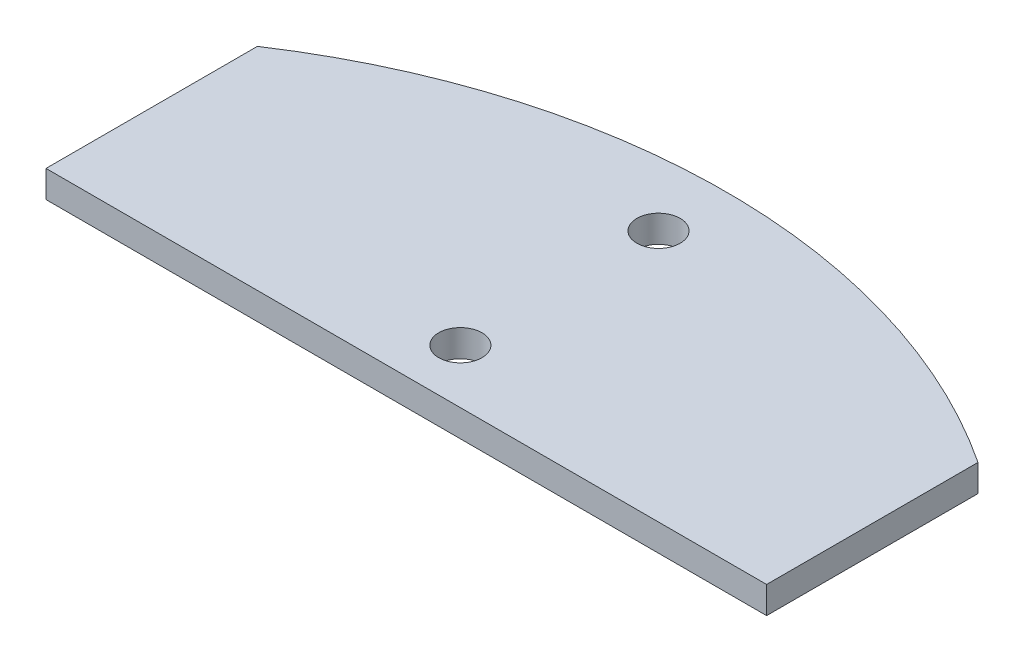
ISO-10303-21;
HEADER;
FILE_DESCRIPTION(('STEP AP214'),'2;1');
FILE_NAME('part.step','',(''),(''),'','','');
FILE_SCHEMA(('AUTOMOTIVE_DESIGN { 1 0 10303 214 1 1 1 1 }'));
ENDSEC;
DATA;
#1=APPLICATION_CONTEXT('core data for automotive mechanical design processes');
#2=APPLICATION_PROTOCOL_DEFINITION('international standard','automotive_design',2000,#1);
#3=PRODUCT_CONTEXT('',#1,'mechanical');
#4=PRODUCT('Part','Part','',(#3));
#5=PRODUCT_RELATED_PRODUCT_CATEGORY('part','',(#4));
#6=PRODUCT_DEFINITION_FORMATION('','',#4);
#7=PRODUCT_DEFINITION_CONTEXT('part definition',#1,'design');
#8=PRODUCT_DEFINITION('design','',#6,#7);
#9=PRODUCT_DEFINITION_SHAPE('','',#8);
#10=(LENGTH_UNIT() NAMED_UNIT(*) SI_UNIT(.MILLI.,.METRE.));
#11=(NAMED_UNIT(*) PLANE_ANGLE_UNIT() SI_UNIT($,.RADIAN.));
#12=(NAMED_UNIT(*) SI_UNIT($,.STERADIAN.) SOLID_ANGLE_UNIT());
#13=UNCERTAINTY_MEASURE_WITH_UNIT(LENGTH_MEASURE(1.E-05),#10,'distance_accuracy_value','');
#14=(GEOMETRIC_REPRESENTATION_CONTEXT(3) GLOBAL_UNCERTAINTY_ASSIGNED_CONTEXT((#13)) GLOBAL_UNIT_ASSIGNED_CONTEXT((#10,
#11,#12)) REPRESENTATION_CONTEXT('',''));
#15=CARTESIAN_POINT('',(0.,0.,0.));
#16=DIRECTION('',(0.,0.,1.));
#17=DIRECTION('',(1.,0.,0.));
#18=AXIS2_PLACEMENT_3D('',#15,#16,#17);
#19=CARTESIAN_POINT('',(0.,3.,0.));
#20=DIRECTION('',(0.,-1.,0.));
#21=DIRECTION('',(0.,0.,-1.));
#22=AXIS2_PLACEMENT_3D('',#19,#20,#21);
#23=CYLINDRICAL_SURFACE('',#22,72.5);
#24=DIRECTION('',(0.,-1.,0.));
#25=VECTOR('',#24,1.);
#26=CARTESIAN_POINT('',(-40.,3.,-60.4669331122391));
#27=LINE('',#26,#25);
#28=CARTESIAN_POINT('',(-40.,3.,-60.4669331122391));
#29=VERTEX_POINT('',#28);
#30=CARTESIAN_POINT('',(-40.,0.,-60.4669331122391));
#31=VERTEX_POINT('',#30);
#32=EDGE_CURVE('E110',#29,#31,#27,.T.);
#33=ORIENTED_EDGE('',*,*,#32,.F.);
#34=CARTESIAN_POINT('',(0.,3.,0.));
#35=DIRECTION('',(0.,1.,0.));
#36=DIRECTION('',(0.,0.,1.));
#37=AXIS2_PLACEMENT_3D('',#34,#35,#36);
#38=CIRCLE('',#37,72.5);
#39=CARTESIAN_POINT('',(40.,3.,-60.4669331122391));
#40=VERTEX_POINT('',#39);
#41=EDGE_CURVE('E44',#40,#29,#38,.T.);
#42=ORIENTED_EDGE('',*,*,#41,.F.);
#43=DIRECTION('',(0.,-1.,0.));
#44=VECTOR('',#43,1.);
#45=CARTESIAN_POINT('',(40.,3.,-60.4669331122391));
#46=LINE('',#45,#44);
#47=CARTESIAN_POINT('',(40.,0.,-60.4669331122391));
#48=VERTEX_POINT('',#47);
#49=EDGE_CURVE('E81',#48,#40,#46,.F.);
#50=ORIENTED_EDGE('',*,*,#49,.F.);
#51=CARTESIAN_POINT('',(0.,0.,0.));
#52=DIRECTION('',(0.,1.,0.));
#53=DIRECTION('',(0.,0.,1.));
#54=AXIS2_PLACEMENT_3D('',#51,#52,#53);
#55=CIRCLE('',#54,72.5);
#56=EDGE_CURVE('E106',#48,#31,#55,.T.);
#57=ORIENTED_EDGE('',*,*,#56,.T.);
#58=EDGE_LOOP('',(#33,#42,#50,#57));
#59=FACE_BOUND('',#58,.T.);
#60=ADVANCED_FACE('F36',(#59),#23,.T.);
#61=CARTESIAN_POINT('',(-17.0115720529893,3.,29.1490808823529));
#62=DIRECTION('',(0.,-1.,0.));
#63=DIRECTION('',(0.,0.,-1.));
#64=AXIS2_PLACEMENT_3D('',#61,#62,#63);
#65=PLANE('',#64);
#66=CARTESIAN_POINT('',(0.,3.,-43.));
#67=DIRECTION('',(0.,-1.,0.));
#68=DIRECTION('',(0.,0.,-1.));
#69=AXIS2_PLACEMENT_3D('',#66,#67,#68);
#70=CIRCLE('',#69,2.4);
#71=CARTESIAN_POINT('',(0.,3.,-45.4));
#72=VERTEX_POINT('',#71);
#73=EDGE_CURVE('E123',#72,#72,#70,.T.);
#74=ORIENTED_EDGE('',*,*,#73,.T.);
#75=EDGE_LOOP('',(#74));
#76=FACE_BOUND('',#75,.T.);
#77=CARTESIAN_POINT('',(0.,3.,-65.));
#78=DIRECTION('',(0.,-1.,0.));
#79=DIRECTION('',(0.,0.,-1.));
#80=AXIS2_PLACEMENT_3D('',#77,#78,#79);
#81=CIRCLE('',#80,2.4);
#82=CARTESIAN_POINT('',(0.,3.,-67.4));
#83=VERTEX_POINT('',#82);
#84=EDGE_CURVE('E100',#83,#83,#81,.T.);
#85=ORIENTED_EDGE('',*,*,#84,.T.);
#86=EDGE_LOOP('',(#85));
#87=FACE_BOUND('',#86,.T.);
#88=DIRECTION('',(0.,0.,-1.));
#89=VECTOR('',#88,1.);
#90=CARTESIAN_POINT('',(-40.,3.,-37.));
#91=LINE('',#90,#89);
#92=CARTESIAN_POINT('',(-40.,3.,-37.));
#93=VERTEX_POINT('',#92);
#94=EDGE_CURVE('E59',#93,#29,#91,.T.);
#95=ORIENTED_EDGE('',*,*,#94,.F.);
#96=DIRECTION('',(-1.,0.,0.));
#97=VECTOR('',#96,1.);
#98=CARTESIAN_POINT('',(40.,3.,-37.));
#99=LINE('',#98,#97);
#100=CARTESIAN_POINT('',(40.,3.,-37.));
#101=VERTEX_POINT('',#100);
#102=EDGE_CURVE('E86',#101,#93,#99,.T.);
#103=ORIENTED_EDGE('',*,*,#102,.F.);
#104=DIRECTION('',(0.,0.,1.));
#105=VECTOR('',#104,1.);
#106=CARTESIAN_POINT('',(40.,3.,-37.));
#107=LINE('',#106,#105);
#108=EDGE_CURVE('E77',#40,#101,#107,.T.);
#109=ORIENTED_EDGE('',*,*,#108,.F.);
#110=ORIENTED_EDGE('',*,*,#41,.T.);
#111=EDGE_LOOP('',(#95,#103,#109,#110));
#112=FACE_BOUND('',#111,.T.);
#113=ADVANCED_FACE('F92',(#76,#87,#112),#65,.F.);
#114=CARTESIAN_POINT('',(-17.0115720529893,0.,29.1490808823529));
#115=DIRECTION('',(0.,-1.,0.));
#116=DIRECTION('',(0.,0.,-1.));
#117=AXIS2_PLACEMENT_3D('',#114,#115,#116);
#118=PLANE('',#117);
#119=CARTESIAN_POINT('',(0.,0.,-43.));
#120=DIRECTION('',(0.,-1.,0.));
#121=DIRECTION('',(0.,0.,-1.));
#122=AXIS2_PLACEMENT_3D('',#119,#120,#121);
#123=CIRCLE('',#122,2.4);
#124=CARTESIAN_POINT('',(0.,0.,-45.4));
#125=VERTEX_POINT('',#124);
#126=EDGE_CURVE('E126',#125,#125,#123,.T.);
#127=ORIENTED_EDGE('',*,*,#126,.F.);
#128=EDGE_LOOP('',(#127));
#129=FACE_BOUND('',#128,.T.);
#130=CARTESIAN_POINT('',(0.,0.,-65.));
#131=DIRECTION('',(0.,-1.,0.));
#132=DIRECTION('',(0.,0.,-1.));
#133=AXIS2_PLACEMENT_3D('',#130,#131,#132);
#134=CIRCLE('',#133,2.4);
#135=CARTESIAN_POINT('',(0.,0.,-67.4));
#136=VERTEX_POINT('',#135);
#137=EDGE_CURVE('E119',#136,#136,#134,.T.);
#138=ORIENTED_EDGE('',*,*,#137,.F.);
#139=EDGE_LOOP('',(#138));
#140=FACE_BOUND('',#139,.T.);
#141=DIRECTION('',(-1.,0.,0.));
#142=VECTOR('',#141,1.);
#143=CARTESIAN_POINT('',(40.,0.,-37.));
#144=LINE('',#143,#142);
#145=CARTESIAN_POINT('',(40.,0.,-37.));
#146=VERTEX_POINT('',#145);
#147=CARTESIAN_POINT('',(-40.,0.,-37.));
#148=VERTEX_POINT('',#147);
#149=EDGE_CURVE('E51',#146,#148,#144,.T.);
#150=ORIENTED_EDGE('',*,*,#149,.T.);
#151=DIRECTION('',(0.,0.,-1.));
#152=VECTOR('',#151,1.);
#153=CARTESIAN_POINT('',(-40.,0.,-37.));
#154=LINE('',#153,#152);
#155=EDGE_CURVE('E96',#148,#31,#154,.T.);
#156=ORIENTED_EDGE('',*,*,#155,.T.);
#157=ORIENTED_EDGE('',*,*,#56,.F.);
#158=DIRECTION('',(0.,0.,1.));
#159=VECTOR('',#158,1.);
#160=CARTESIAN_POINT('',(40.,0.,29.1490808823529));
#161=LINE('',#160,#159);
#162=EDGE_CURVE('E13',#48,#146,#161,.T.);
#163=ORIENTED_EDGE('',*,*,#162,.T.);
#164=EDGE_LOOP('',(#150,#156,#157,#163));
#165=FACE_BOUND('',#164,.T.);
#166=ADVANCED_FACE('F117',(#129,#140,#165),#118,.T.);
#167=CARTESIAN_POINT('',(-40.,3.,-37.));
#168=DIRECTION('',(-1.,0.,0.));
#169=DIRECTION('',(0.,0.,1.));
#170=AXIS2_PLACEMENT_3D('',#167,#168,#169);
#171=PLANE('',#170);
#172=ORIENTED_EDGE('',*,*,#32,.T.);
#173=ORIENTED_EDGE('',*,*,#155,.F.);
#174=DIRECTION('',(0.,-1.,0.));
#175=VECTOR('',#174,1.);
#176=CARTESIAN_POINT('',(-40.,3.,-37.));
#177=LINE('',#176,#175);
#178=EDGE_CURVE('E90',#93,#148,#177,.T.);
#179=ORIENTED_EDGE('',*,*,#178,.F.);
#180=ORIENTED_EDGE('',*,*,#94,.T.);
#181=EDGE_LOOP('',(#172,#173,#179,#180));
#182=FACE_BOUND('',#181,.T.);
#183=ADVANCED_FACE('F114',(#182),#171,.T.);
#184=CARTESIAN_POINT('',(40.,3.,-37.));
#185=DIRECTION('',(1.,0.,0.));
#186=DIRECTION('',(0.,0.,-1.));
#187=AXIS2_PLACEMENT_3D('',#184,#185,#186);
#188=PLANE('',#187);
#189=ORIENTED_EDGE('',*,*,#49,.T.);
#190=ORIENTED_EDGE('',*,*,#108,.T.);
#191=DIRECTION('',(0.,-1.,0.));
#192=VECTOR('',#191,1.);
#193=CARTESIAN_POINT('',(40.,3.,-37.));
#194=LINE('',#193,#192);
#195=EDGE_CURVE('E79',#101,#146,#194,.T.);
#196=ORIENTED_EDGE('',*,*,#195,.T.);
#197=ORIENTED_EDGE('',*,*,#162,.F.);
#198=EDGE_LOOP('',(#189,#190,#196,#197));
#199=FACE_BOUND('',#198,.T.);
#200=ADVANCED_FACE('F78',(#199),#188,.T.);
#201=CARTESIAN_POINT('',(40.,3.,-37.));
#202=DIRECTION('',(0.,0.,1.));
#203=DIRECTION('',(1.,0.,0.));
#204=AXIS2_PLACEMENT_3D('',#201,#202,#203);
#205=PLANE('',#204);
#206=ORIENTED_EDGE('',*,*,#149,.F.);
#207=ORIENTED_EDGE('',*,*,#195,.F.);
#208=ORIENTED_EDGE('',*,*,#102,.T.);
#209=ORIENTED_EDGE('',*,*,#178,.T.);
#210=EDGE_LOOP('',(#206,#207,#208,#209));
#211=FACE_BOUND('',#210,.T.);
#212=ADVANCED_FACE('F89',(#211),#205,.T.);
#213=CARTESIAN_POINT('',(0.,3.,-65.));
#214=DIRECTION('',(0.,-1.,0.));
#215=DIRECTION('',(0.,0.,-1.));
#216=AXIS2_PLACEMENT_3D('',#213,#214,#215);
#217=CYLINDRICAL_SURFACE('',#216,2.4);
#218=ORIENTED_EDGE('',*,*,#84,.F.);
#219=EDGE_LOOP('',(#218));
#220=FACE_BOUND('',#219,.T.);
#221=ORIENTED_EDGE('',*,*,#137,.T.);
#222=EDGE_LOOP('',(#221));
#223=FACE_BOUND('',#222,.T.);
#224=ADVANCED_FACE('F138',(#220,#223),#217,.F.);
#225=CARTESIAN_POINT('',(0.,3.,-43.));
#226=DIRECTION('',(0.,-1.,0.));
#227=DIRECTION('',(0.,0.,-1.));
#228=AXIS2_PLACEMENT_3D('',#225,#226,#227);
#229=CYLINDRICAL_SURFACE('',#228,2.4);
#230=ORIENTED_EDGE('',*,*,#73,.F.);
#231=EDGE_LOOP('',(#230));
#232=FACE_BOUND('',#231,.T.);
#233=ORIENTED_EDGE('',*,*,#126,.T.);
#234=EDGE_LOOP('',(#233));
#235=FACE_BOUND('',#234,.T.);
#236=ADVANCED_FACE('F135',(#232,#235),#229,.F.);
#237=CLOSED_SHELL('',(#60,#113,#166,#183,#200,#212,#224,#236));
#238=MANIFOLD_SOLID_BREP('B2',#237);
#239=ADVANCED_BREP_SHAPE_REPRESENTATION('',(#18,#238),#14);
#240=SHAPE_DEFINITION_REPRESENTATION(#9,#239);
ENDSEC;
END-ISO-10303-21;
